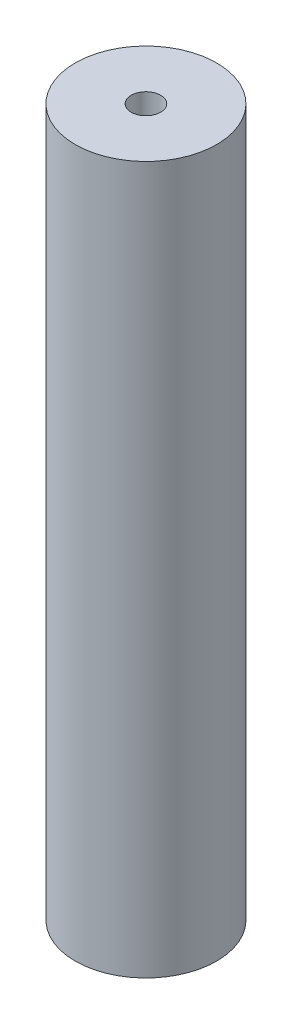
ISO-10303-21;
HEADER;
FILE_DESCRIPTION(('STEP AP214'),'2;1');
FILE_NAME('part.step','',(''),(''),'','','');
FILE_SCHEMA(('AUTOMOTIVE_DESIGN { 1 0 10303 214 1 1 1 1 }'));
ENDSEC;
DATA;
#1=APPLICATION_CONTEXT('core data for automotive mechanical design processes');
#2=APPLICATION_PROTOCOL_DEFINITION('international standard','automotive_design',2000,#1);
#3=PRODUCT_CONTEXT('',#1,'mechanical');
#4=PRODUCT('Part','Part','',(#3));
#5=PRODUCT_RELATED_PRODUCT_CATEGORY('part','',(#4));
#6=PRODUCT_DEFINITION_FORMATION('','',#4);
#7=PRODUCT_DEFINITION_CONTEXT('part definition',#1,'design');
#8=PRODUCT_DEFINITION('design','',#6,#7);
#9=PRODUCT_DEFINITION_SHAPE('','',#8);
#10=(LENGTH_UNIT() NAMED_UNIT(*) SI_UNIT(.MILLI.,.METRE.));
#11=(NAMED_UNIT(*) PLANE_ANGLE_UNIT() SI_UNIT($,.RADIAN.));
#12=(NAMED_UNIT(*) SI_UNIT($,.STERADIAN.) SOLID_ANGLE_UNIT());
#13=UNCERTAINTY_MEASURE_WITH_UNIT(LENGTH_MEASURE(1.E-05),#10,'distance_accuracy_value','');
#14=(GEOMETRIC_REPRESENTATION_CONTEXT(3) GLOBAL_UNCERTAINTY_ASSIGNED_CONTEXT((#13)) GLOBAL_UNIT_ASSIGNED_CONTEXT((#10,
#11,#12)) REPRESENTATION_CONTEXT('',''));
#15=CARTESIAN_POINT('',(0.,0.,0.));
#16=DIRECTION('',(0.,0.,1.));
#17=DIRECTION('',(1.,0.,0.));
#18=AXIS2_PLACEMENT_3D('',#15,#16,#17);
#19=CARTESIAN_POINT('',(0.,60.,0.));
#20=DIRECTION('',(0.,-1.,0.));
#21=DIRECTION('',(0.,0.,-1.));
#22=AXIS2_PLACEMENT_3D('',#19,#20,#21);
#23=CYLINDRICAL_SURFACE('',#22,6.);
#24=CARTESIAN_POINT('',(0.,60.,0.));
#25=DIRECTION('',(0.,1.,0.));
#26=DIRECTION('',(0.,0.,1.));
#27=AXIS2_PLACEMENT_3D('',#24,#25,#26);
#28=CIRCLE('',#27,6.);
#29=CARTESIAN_POINT('',(0.,60.,6.));
#30=VERTEX_POINT('',#29);
#31=EDGE_CURVE('E10',#30,#30,#28,.T.);
#32=ORIENTED_EDGE('',*,*,#31,.F.);
#33=EDGE_LOOP('',(#32));
#34=FACE_BOUND('',#33,.T.);
#35=CARTESIAN_POINT('',(0.,0.,0.));
#36=DIRECTION('',(0.,1.,0.));
#37=DIRECTION('',(0.,0.,1.));
#38=AXIS2_PLACEMENT_3D('',#35,#36,#37);
#39=CIRCLE('',#38,6.);
#40=CARTESIAN_POINT('',(0.,0.,6.));
#41=VERTEX_POINT('',#40);
#42=EDGE_CURVE('E46',#41,#41,#39,.T.);
#43=ORIENTED_EDGE('',*,*,#42,.T.);
#44=EDGE_LOOP('',(#43));
#45=FACE_BOUND('',#44,.T.);
#46=ADVANCED_FACE('F43',(#34,#45),#23,.T.);
#47=CARTESIAN_POINT('',(0.,60.,0.));
#48=DIRECTION('',(0.,1.,0.));
#49=DIRECTION('',(0.,0.,1.));
#50=AXIS2_PLACEMENT_3D('',#47,#48,#49);
#51=PLANE('',#50);
#52=CARTESIAN_POINT('',(0.,60.,0.));
#53=DIRECTION('',(0.,1.,0.));
#54=DIRECTION('',(0.,0.,1.));
#55=AXIS2_PLACEMENT_3D('',#52,#53,#54);
#56=CIRCLE('',#55,1.25);
#57=CARTESIAN_POINT('',(0.,60.,1.25));
#58=VERTEX_POINT('',#57);
#59=EDGE_CURVE('E60',#58,#58,#56,.T.);
#60=ORIENTED_EDGE('',*,*,#59,.F.);
#61=EDGE_LOOP('',(#60));
#62=FACE_BOUND('',#61,.T.);
#63=ORIENTED_EDGE('',*,*,#31,.T.);
#64=EDGE_LOOP('',(#63));
#65=FACE_BOUND('',#64,.T.);
#66=ADVANCED_FACE('F67',(#62,#65),#51,.T.);
#67=CARTESIAN_POINT('',(0.,0.,0.));
#68=DIRECTION('',(0.,1.,0.));
#69=DIRECTION('',(0.,0.,1.));
#70=AXIS2_PLACEMENT_3D('',#67,#68,#69);
#71=PLANE('',#70);
#72=CARTESIAN_POINT('',(0.,0.,0.));
#73=DIRECTION('',(0.,1.,0.));
#74=DIRECTION('',(0.,0.,1.));
#75=AXIS2_PLACEMENT_3D('',#72,#73,#74);
#76=CIRCLE('',#75,1.24999999999999);
#77=CARTESIAN_POINT('',(0.,0.,1.24999999999999));
#78=VERTEX_POINT('',#77);
#79=EDGE_CURVE('E55',#78,#78,#76,.T.);
#80=ORIENTED_EDGE('',*,*,#79,.T.);
#81=EDGE_LOOP('',(#80));
#82=FACE_BOUND('',#81,.T.);
#83=ORIENTED_EDGE('',*,*,#42,.F.);
#84=EDGE_LOOP('',(#83));
#85=FACE_BOUND('',#84,.T.);
#86=ADVANCED_FACE('F69',(#82,#85),#71,.F.);
#87=CARTESIAN_POINT('',(0.,60.,0.));
#88=DIRECTION('',(0.,1.,0.));
#89=DIRECTION('',(0.,0.,1.));
#90=AXIS2_PLACEMENT_3D('',#87,#88,#89);
#91=CYLINDRICAL_SURFACE('',#90,1.24999999999999);
#92=ORIENTED_EDGE('',*,*,#79,.F.);
#93=EDGE_LOOP('',(#92));
#94=FACE_BOUND('',#93,.T.);
#95=ORIENTED_EDGE('',*,*,#59,.T.);
#96=EDGE_LOOP('',(#95));
#97=FACE_BOUND('',#96,.T.);
#98=ADVANCED_FACE('F65',(#94,#97),#91,.F.);
#99=CLOSED_SHELL('',(#46,#66,#86,#98));
#100=MANIFOLD_SOLID_BREP('B2',#99);
#101=ADVANCED_BREP_SHAPE_REPRESENTATION('',(#18,#100),#14);
#102=SHAPE_DEFINITION_REPRESENTATION(#9,#101);
ENDSEC;
END-ISO-10303-21;
